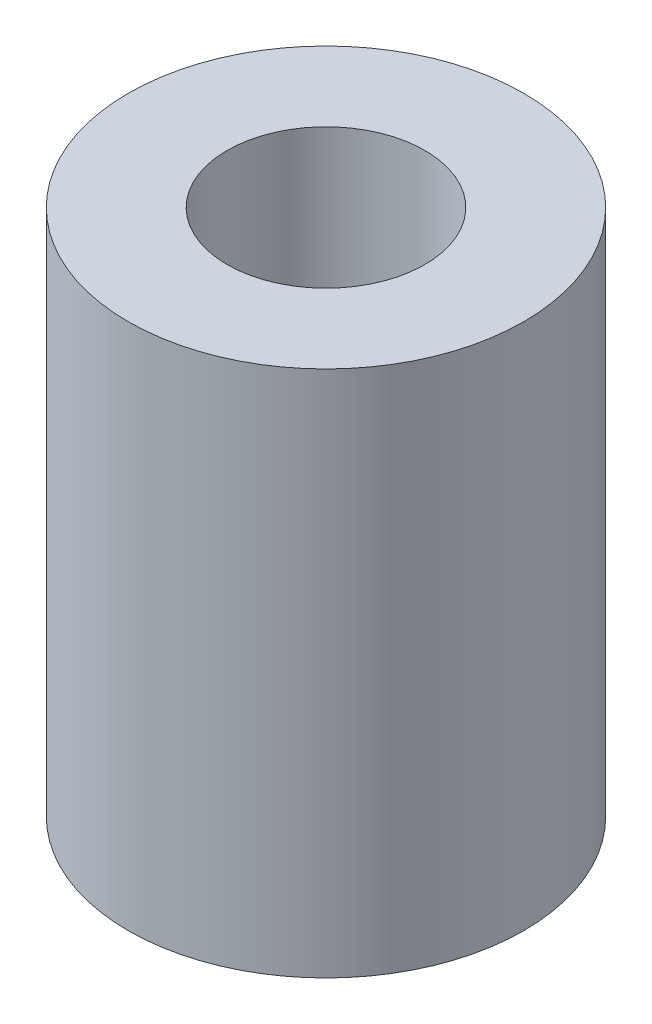
ISO-10303-21;
HEADER;
FILE_DESCRIPTION(('STEP AP214'),'2;1');
FILE_NAME('part.step','',(''),(''),'','','');
FILE_SCHEMA(('AUTOMOTIVE_DESIGN { 1 0 10303 214 1 1 1 1 }'));
ENDSEC;
DATA;
#1=APPLICATION_CONTEXT('core data for automotive mechanical design processes');
#2=APPLICATION_PROTOCOL_DEFINITION('international standard','automotive_design',2000,#1);
#3=PRODUCT_CONTEXT('',#1,'mechanical');
#4=PRODUCT('Part','Part','',(#3));
#5=PRODUCT_RELATED_PRODUCT_CATEGORY('part','',(#4));
#6=PRODUCT_DEFINITION_FORMATION('','',#4);
#7=PRODUCT_DEFINITION_CONTEXT('part definition',#1,'design');
#8=PRODUCT_DEFINITION('design','',#6,#7);
#9=PRODUCT_DEFINITION_SHAPE('','',#8);
#10=(LENGTH_UNIT() NAMED_UNIT(*) SI_UNIT(.MILLI.,.METRE.));
#11=(NAMED_UNIT(*) PLANE_ANGLE_UNIT() SI_UNIT($,.RADIAN.));
#12=(NAMED_UNIT(*) SI_UNIT($,.STERADIAN.) SOLID_ANGLE_UNIT());
#13=UNCERTAINTY_MEASURE_WITH_UNIT(LENGTH_MEASURE(1.E-05),#10,'distance_accuracy_value','');
#14=(GEOMETRIC_REPRESENTATION_CONTEXT(3) GLOBAL_UNCERTAINTY_ASSIGNED_CONTEXT((#13)) GLOBAL_UNIT_ASSIGNED_CONTEXT((#10,
#11,#12)) REPRESENTATION_CONTEXT('',''));
#15=CARTESIAN_POINT('',(0.,0.,0.));
#16=DIRECTION('',(0.,0.,1.));
#17=DIRECTION('',(1.,0.,0.));
#18=AXIS2_PLACEMENT_3D('',#15,#16,#17);
#19=CARTESIAN_POINT('',(0.,8.,0.));
#20=DIRECTION('',(0.,1.,0.));
#21=DIRECTION('',(0.,0.,1.));
#22=AXIS2_PLACEMENT_3D('',#19,#20,#21);
#23=PLANE('',#22);
#24=CARTESIAN_POINT('',(0.,8.,0.));
#25=DIRECTION('',(0.,1.,0.));
#26=DIRECTION('',(0.,0.,1.));
#27=AXIS2_PLACEMENT_3D('',#24,#25,#26);
#28=CIRCLE('',#27,3.);
#29=CARTESIAN_POINT('',(0.,8.,3.));
#30=VERTEX_POINT('',#29);
#31=EDGE_CURVE('E10',#30,#30,#28,.T.);
#32=ORIENTED_EDGE('',*,*,#31,.T.);
#33=EDGE_LOOP('',(#32));
#34=FACE_BOUND('',#33,.T.);
#35=CARTESIAN_POINT('',(0.,8.,0.));
#36=DIRECTION('',(0.,1.,0.));
#37=DIRECTION('',(0.,0.,1.));
#38=AXIS2_PLACEMENT_3D('',#35,#36,#37);
#39=CIRCLE('',#38,1.5);
#40=CARTESIAN_POINT('',(0.,8.,1.5));
#41=VERTEX_POINT('',#40);
#42=EDGE_CURVE('E41',#41,#41,#39,.T.);
#43=ORIENTED_EDGE('',*,*,#42,.F.);
#44=EDGE_LOOP('',(#43));
#45=FACE_BOUND('',#44,.T.);
#46=ADVANCED_FACE('F30',(#34,#45),#23,.T.);
#47=CARTESIAN_POINT('',(0.,0.,0.));
#48=DIRECTION('',(0.,1.,0.));
#49=DIRECTION('',(0.,0.,1.));
#50=AXIS2_PLACEMENT_3D('',#47,#48,#49);
#51=PLANE('',#50);
#52=CARTESIAN_POINT('',(0.,0.,0.));
#53=DIRECTION('',(0.,1.,0.));
#54=DIRECTION('',(0.,0.,1.));
#55=AXIS2_PLACEMENT_3D('',#52,#53,#54);
#56=CIRCLE('',#55,3.);
#57=CARTESIAN_POINT('',(0.,0.,3.));
#58=VERTEX_POINT('',#57);
#59=EDGE_CURVE('E34',#58,#58,#56,.T.);
#60=ORIENTED_EDGE('',*,*,#59,.F.);
#61=EDGE_LOOP('',(#60));
#62=FACE_BOUND('',#61,.T.);
#63=CARTESIAN_POINT('',(0.,0.,0.));
#64=DIRECTION('',(0.,1.,0.));
#65=DIRECTION('',(0.,0.,1.));
#66=AXIS2_PLACEMENT_3D('',#63,#64,#65);
#67=CIRCLE('',#66,1.5);
#68=CARTESIAN_POINT('',(0.,0.,1.5));
#69=VERTEX_POINT('',#68);
#70=EDGE_CURVE('E43',#69,#69,#67,.T.);
#71=ORIENTED_EDGE('',*,*,#70,.T.);
#72=EDGE_LOOP('',(#71));
#73=FACE_BOUND('',#72,.T.);
#74=ADVANCED_FACE('F53',(#62,#73),#51,.F.);
#75=CARTESIAN_POINT('',(0.,8.,0.));
#76=DIRECTION('',(0.,-1.,0.));
#77=DIRECTION('',(0.,0.,-1.));
#78=AXIS2_PLACEMENT_3D('',#75,#76,#77);
#79=CYLINDRICAL_SURFACE('',#78,3.);
#80=ORIENTED_EDGE('',*,*,#31,.F.);
#81=EDGE_LOOP('',(#80));
#82=FACE_BOUND('',#81,.T.);
#83=ORIENTED_EDGE('',*,*,#59,.T.);
#84=EDGE_LOOP('',(#83));
#85=FACE_BOUND('',#84,.T.);
#86=ADVANCED_FACE('F32',(#82,#85),#79,.T.);
#87=CARTESIAN_POINT('',(0.,8.,0.));
#88=DIRECTION('',(0.,-1.,0.));
#89=DIRECTION('',(0.,0.,-1.));
#90=AXIS2_PLACEMENT_3D('',#87,#88,#89);
#91=CYLINDRICAL_SURFACE('',#90,1.5);
#92=ORIENTED_EDGE('',*,*,#42,.T.);
#93=EDGE_LOOP('',(#92));
#94=FACE_BOUND('',#93,.T.);
#95=ORIENTED_EDGE('',*,*,#70,.F.);
#96=EDGE_LOOP('',(#95));
#97=FACE_BOUND('',#96,.T.);
#98=ADVANCED_FACE('F49',(#94,#97),#91,.F.);
#99=CLOSED_SHELL('',(#46,#74,#86,#98));
#100=MANIFOLD_SOLID_BREP('B2',#99);
#101=ADVANCED_BREP_SHAPE_REPRESENTATION('',(#18,#100),#14);
#102=SHAPE_DEFINITION_REPRESENTATION(#9,#101);
ENDSEC;
END-ISO-10303-21;
